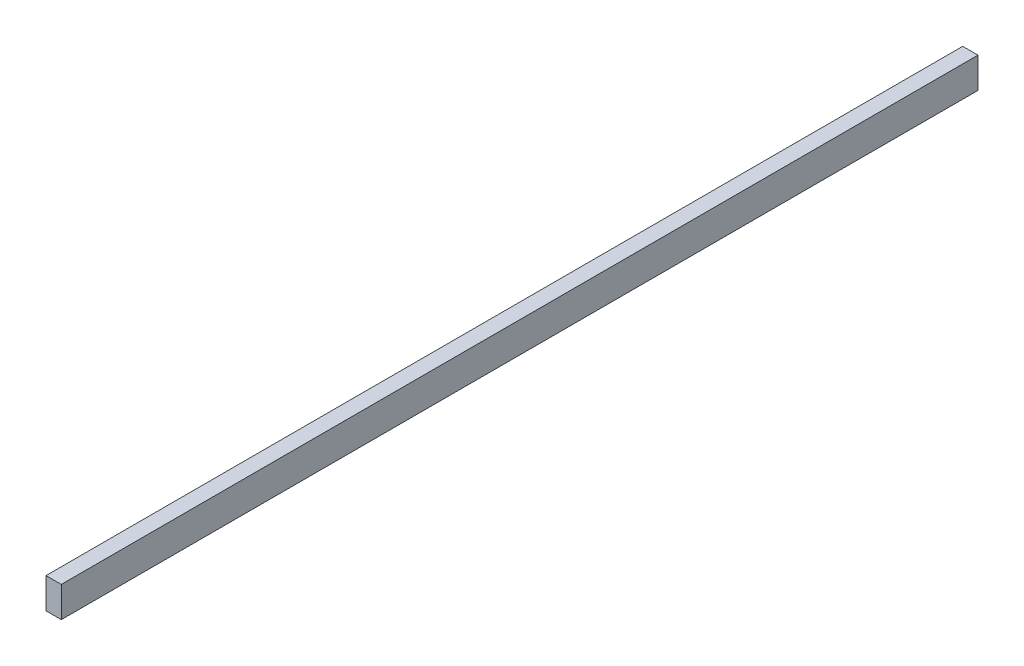
ISO-10303-21;
HEADER;
FILE_DESCRIPTION(('STEP AP214'),'2;1');
FILE_NAME('part.step','',(''),(''),'','','');
FILE_SCHEMA(('AUTOMOTIVE_DESIGN { 1 0 10303 214 1 1 1 1 }'));
ENDSEC;
DATA;
#1=APPLICATION_CONTEXT('core data for automotive mechanical design processes');
#2=APPLICATION_PROTOCOL_DEFINITION('international standard','automotive_design',2000,#1);
#3=PRODUCT_CONTEXT('',#1,'mechanical');
#4=PRODUCT('Part','Part','',(#3));
#5=PRODUCT_RELATED_PRODUCT_CATEGORY('part','',(#4));
#6=PRODUCT_DEFINITION_FORMATION('','',#4);
#7=PRODUCT_DEFINITION_CONTEXT('part definition',#1,'design');
#8=PRODUCT_DEFINITION('design','',#6,#7);
#9=PRODUCT_DEFINITION_SHAPE('','',#8);
#10=(LENGTH_UNIT() NAMED_UNIT(*) SI_UNIT(.MILLI.,.METRE.));
#11=(NAMED_UNIT(*) PLANE_ANGLE_UNIT() SI_UNIT($,.RADIAN.));
#12=(NAMED_UNIT(*) SI_UNIT($,.STERADIAN.) SOLID_ANGLE_UNIT());
#13=UNCERTAINTY_MEASURE_WITH_UNIT(LENGTH_MEASURE(1.E-05),#10,'distance_accuracy_value','');
#14=(GEOMETRIC_REPRESENTATION_CONTEXT(3) GLOBAL_UNCERTAINTY_ASSIGNED_CONTEXT((#13)) GLOBAL_UNIT_ASSIGNED_CONTEXT((#10,
#11,#12)) REPRESENTATION_CONTEXT('',''));
#15=CARTESIAN_POINT('',(0.,0.,0.));
#16=DIRECTION('',(0.,0.,1.));
#17=DIRECTION('',(1.,0.,0.));
#18=AXIS2_PLACEMENT_3D('',#15,#16,#17);
#19=CARTESIAN_POINT('',(-78.7671265619035,27.3594803155219,1524.));
#20=DIRECTION('',(1.,0.,0.));
#21=DIRECTION('',(0.,0.,-1.));
#22=AXIS2_PLACEMENT_3D('',#19,#20,#21);
#23=PLANE('',#22);
#24=DIRECTION('',(0.,-1.,0.));
#25=VECTOR('',#24,1.);
#26=CARTESIAN_POINT('',(-78.7671265619035,27.3594803155219,0.));
#27=LINE('',#26,#25);
#28=CARTESIAN_POINT('',(-78.7671265619035,27.3594803155219,0.));
#29=VERTEX_POINT('',#28);
#30=CARTESIAN_POINT('',(-78.7671265619035,-23.4405196844781,0.));
#31=VERTEX_POINT('',#30);
#32=EDGE_CURVE('E107',#29,#31,#27,.T.);
#33=ORIENTED_EDGE('',*,*,#32,.T.);
#34=DIRECTION('',(0.,0.,-1.));
#35=VECTOR('',#34,1.);
#36=CARTESIAN_POINT('',(-78.7671265619035,-23.4405196844781,1524.));
#37=LINE('',#36,#35);
#38=CARTESIAN_POINT('',(-78.7671265619035,-23.4405196844781,1524.));
#39=VERTEX_POINT('',#38);
#40=EDGE_CURVE('E11',#39,#31,#37,.T.);
#41=ORIENTED_EDGE('',*,*,#40,.F.);
#42=DIRECTION('',(0.,-1.,0.));
#43=VECTOR('',#42,1.);
#44=CARTESIAN_POINT('',(-78.7671265619035,27.3594803155219,1524.));
#45=LINE('',#44,#43);
#46=CARTESIAN_POINT('',(-78.7671265619035,27.3594803155219,1524.));
#47=VERTEX_POINT('',#46);
#48=EDGE_CURVE('E91',#47,#39,#45,.T.);
#49=ORIENTED_EDGE('',*,*,#48,.F.);
#50=DIRECTION('',(0.,0.,-1.));
#51=VECTOR('',#50,1.);
#52=CARTESIAN_POINT('',(-78.7671265619035,27.3594803155219,1524.));
#53=LINE('',#52,#51);
#54=EDGE_CURVE('E103',#47,#29,#53,.T.);
#55=ORIENTED_EDGE('',*,*,#54,.T.);
#56=EDGE_LOOP('',(#33,#41,#49,#55));
#57=FACE_BOUND('',#56,.T.);
#58=ADVANCED_FACE('F39',(#57),#23,.F.);
#59=CARTESIAN_POINT('',(-78.7671265619035,-23.4405196844781,1524.));
#60=DIRECTION('',(0.,1.,0.));
#61=DIRECTION('',(0.,0.,1.));
#62=AXIS2_PLACEMENT_3D('',#59,#60,#61);
#63=PLANE('',#62);
#64=DIRECTION('',(1.,0.,0.));
#65=VECTOR('',#64,1.);
#66=CARTESIAN_POINT('',(-78.7671265619035,-23.4405196844781,0.));
#67=LINE('',#66,#65);
#68=CARTESIAN_POINT('',(-53.3671265619035,-23.4405196844781,0.));
#69=VERTEX_POINT('',#68);
#70=EDGE_CURVE('E96',#31,#69,#67,.T.);
#71=ORIENTED_EDGE('',*,*,#70,.T.);
#72=DIRECTION('',(0.,0.,-1.));
#73=VECTOR('',#72,1.);
#74=CARTESIAN_POINT('',(-53.3671265619035,-23.4405196844781,1524.));
#75=LINE('',#74,#73);
#76=CARTESIAN_POINT('',(-53.3671265619035,-23.4405196844781,1524.));
#77=VERTEX_POINT('',#76);
#78=EDGE_CURVE('E48',#77,#69,#75,.T.);
#79=ORIENTED_EDGE('',*,*,#78,.F.);
#80=DIRECTION('',(1.,0.,0.));
#81=VECTOR('',#80,1.);
#82=CARTESIAN_POINT('',(-78.7671265619035,-23.4405196844781,1524.));
#83=LINE('',#82,#81);
#84=EDGE_CURVE('E86',#39,#77,#83,.T.);
#85=ORIENTED_EDGE('',*,*,#84,.F.);
#86=ORIENTED_EDGE('',*,*,#40,.T.);
#87=EDGE_LOOP('',(#71,#79,#85,#86));
#88=FACE_BOUND('',#87,.T.);
#89=ADVANCED_FACE('F95',(#88),#63,.F.);
#90=CARTESIAN_POINT('',(-53.3671265619035,27.3594803155219,1524.));
#91=DIRECTION('',(-1.,0.,0.));
#92=DIRECTION('',(0.,0.,1.));
#93=AXIS2_PLACEMENT_3D('',#90,#91,#92);
#94=PLANE('',#93);
#95=DIRECTION('',(0.,1.,0.));
#96=VECTOR('',#95,1.);
#97=CARTESIAN_POINT('',(-53.3671265619035,27.3594803155219,0.));
#98=LINE('',#97,#96);
#99=CARTESIAN_POINT('',(-53.3671265619035,27.3594803155219,0.));
#100=VERTEX_POINT('',#99);
#101=EDGE_CURVE('E73',#69,#100,#98,.T.);
#102=ORIENTED_EDGE('',*,*,#101,.T.);
#103=DIRECTION('',(0.,0.,-1.));
#104=VECTOR('',#103,1.);
#105=CARTESIAN_POINT('',(-53.3671265619035,27.3594803155219,1524.));
#106=LINE('',#105,#104);
#107=CARTESIAN_POINT('',(-53.3671265619035,27.3594803155219,1524.));
#108=VERTEX_POINT('',#107);
#109=EDGE_CURVE('E98',#108,#100,#106,.T.);
#110=ORIENTED_EDGE('',*,*,#109,.F.);
#111=DIRECTION('',(0.,1.,0.));
#112=VECTOR('',#111,1.);
#113=CARTESIAN_POINT('',(-53.3671265619035,27.3594803155219,1524.));
#114=LINE('',#113,#112);
#115=EDGE_CURVE('E89',#77,#108,#114,.T.);
#116=ORIENTED_EDGE('',*,*,#115,.F.);
#117=ORIENTED_EDGE('',*,*,#78,.T.);
#118=EDGE_LOOP('',(#102,#110,#116,#117));
#119=FACE_BOUND('',#118,.T.);
#120=ADVANCED_FACE('F99',(#119),#94,.F.);
#121=CARTESIAN_POINT('',(-78.7671265619035,27.3594803155219,1524.));
#122=DIRECTION('',(0.,-1.,0.));
#123=DIRECTION('',(0.,0.,-1.));
#124=AXIS2_PLACEMENT_3D('',#121,#122,#123);
#125=PLANE('',#124);
#126=DIRECTION('',(-1.,0.,0.));
#127=VECTOR('',#126,1.);
#128=CARTESIAN_POINT('',(-78.7671265619035,27.3594803155219,0.));
#129=LINE('',#128,#127);
#130=EDGE_CURVE('E79',#100,#29,#129,.T.);
#131=ORIENTED_EDGE('',*,*,#130,.T.);
#132=ORIENTED_EDGE('',*,*,#54,.F.);
#133=DIRECTION('',(-1.,0.,0.));
#134=VECTOR('',#133,1.);
#135=CARTESIAN_POINT('',(-78.7671265619035,27.3594803155219,1524.));
#136=LINE('',#135,#134);
#137=EDGE_CURVE('E56',#108,#47,#136,.T.);
#138=ORIENTED_EDGE('',*,*,#137,.F.);
#139=ORIENTED_EDGE('',*,*,#109,.T.);
#140=EDGE_LOOP('',(#131,#132,#138,#139));
#141=FACE_BOUND('',#140,.T.);
#142=ADVANCED_FACE('F120',(#141),#125,.F.);
#143=CARTESIAN_POINT('',(0.,0.,1524.));
#144=DIRECTION('',(0.,0.,1.));
#145=DIRECTION('',(1.,0.,0.));
#146=AXIS2_PLACEMENT_3D('',#143,#144,#145);
#147=PLANE('',#146);
#148=ORIENTED_EDGE('',*,*,#48,.T.);
#149=ORIENTED_EDGE('',*,*,#84,.T.);
#150=ORIENTED_EDGE('',*,*,#115,.T.);
#151=ORIENTED_EDGE('',*,*,#137,.T.);
#152=EDGE_LOOP('',(#148,#149,#150,#151));
#153=FACE_BOUND('',#152,.T.);
#154=ADVANCED_FACE('F87',(#153),#147,.T.);
#155=CARTESIAN_POINT('',(0.,0.,0.));
#156=DIRECTION('',(0.,0.,1.));
#157=DIRECTION('',(1.,0.,0.));
#158=AXIS2_PLACEMENT_3D('',#155,#156,#157);
#159=PLANE('',#158);
#160=ORIENTED_EDGE('',*,*,#32,.F.);
#161=ORIENTED_EDGE('',*,*,#130,.F.);
#162=ORIENTED_EDGE('',*,*,#101,.F.);
#163=ORIENTED_EDGE('',*,*,#70,.F.);
#164=EDGE_LOOP('',(#160,#161,#162,#163));
#165=FACE_BOUND('',#164,.T.);
#166=ADVANCED_FACE('F123',(#165),#159,.F.);
#167=CLOSED_SHELL('',(#58,#89,#120,#142,#154,#166));
#168=MANIFOLD_SOLID_BREP('B2',#167);
#169=ADVANCED_BREP_SHAPE_REPRESENTATION('',(#18,#168),#14);
#170=SHAPE_DEFINITION_REPRESENTATION(#9,#169);
ENDSEC;
END-ISO-10303-21;
